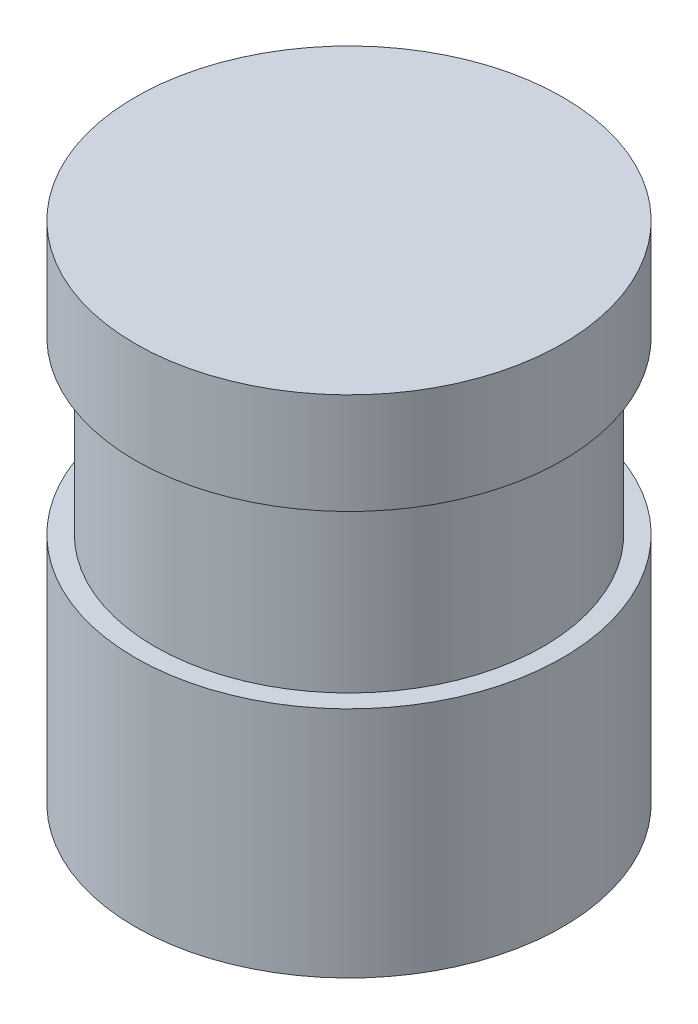
ISO-10303-21;
HEADER;
FILE_DESCRIPTION(('STEP AP214'),'2;1');
FILE_NAME('part.step','',(''),(''),'','','');
FILE_SCHEMA(('AUTOMOTIVE_DESIGN { 1 0 10303 214 1 1 1 1 }'));
ENDSEC;
DATA;
#1=APPLICATION_CONTEXT('core data for automotive mechanical design processes');
#2=APPLICATION_PROTOCOL_DEFINITION('international standard','automotive_design',2000,#1);
#3=PRODUCT_CONTEXT('',#1,'mechanical');
#4=PRODUCT('Part','Part','',(#3));
#5=PRODUCT_RELATED_PRODUCT_CATEGORY('part','',(#4));
#6=PRODUCT_DEFINITION_FORMATION('','',#4);
#7=PRODUCT_DEFINITION_CONTEXT('part definition',#1,'design');
#8=PRODUCT_DEFINITION('design','',#6,#7);
#9=PRODUCT_DEFINITION_SHAPE('','',#8);
#10=(LENGTH_UNIT() NAMED_UNIT(*) SI_UNIT(.MILLI.,.METRE.));
#11=(NAMED_UNIT(*) PLANE_ANGLE_UNIT() SI_UNIT($,.RADIAN.));
#12=(NAMED_UNIT(*) SI_UNIT($,.STERADIAN.) SOLID_ANGLE_UNIT());
#13=UNCERTAINTY_MEASURE_WITH_UNIT(LENGTH_MEASURE(1.E-05),#10,'distance_accuracy_value','');
#14=(GEOMETRIC_REPRESENTATION_CONTEXT(3) GLOBAL_UNCERTAINTY_ASSIGNED_CONTEXT((#13)) GLOBAL_UNIT_ASSIGNED_CONTEXT((#10,
#11,#12)) REPRESENTATION_CONTEXT('',''));
#15=CARTESIAN_POINT('',(0.,0.,0.));
#16=DIRECTION('',(0.,0.,1.));
#17=DIRECTION('',(1.,0.,0.));
#18=AXIS2_PLACEMENT_3D('',#15,#16,#17);
#19=CARTESIAN_POINT('',(0.,30.,0.));
#20=DIRECTION('',(0.,-1.,0.));
#21=DIRECTION('',(0.,0.,-1.));
#22=AXIS2_PLACEMENT_3D('',#19,#20,#21);
#23=CYLINDRICAL_SURFACE('',#22,27.5);
#24=CARTESIAN_POINT('',(0.,30.,0.));
#25=DIRECTION('',(0.,1.,0.));
#26=DIRECTION('',(0.,0.,1.));
#27=AXIS2_PLACEMENT_3D('',#24,#25,#26);
#28=CIRCLE('',#27,27.5);
#29=CARTESIAN_POINT('',(0.,30.,27.5));
#30=VERTEX_POINT('',#29);
#31=EDGE_CURVE('E45',#30,#30,#28,.T.);
#32=ORIENTED_EDGE('',*,*,#31,.F.);
#33=EDGE_LOOP('',(#32));
#34=FACE_BOUND('',#33,.T.);
#35=CARTESIAN_POINT('',(0.,0.,0.));
#36=DIRECTION('',(0.,1.,0.));
#37=DIRECTION('',(0.,0.,1.));
#38=AXIS2_PLACEMENT_3D('',#35,#36,#37);
#39=CIRCLE('',#38,27.5);
#40=CARTESIAN_POINT('',(0.,0.,27.5));
#41=VERTEX_POINT('',#40);
#42=EDGE_CURVE('E41',#41,#41,#39,.T.);
#43=ORIENTED_EDGE('',*,*,#42,.T.);
#44=EDGE_LOOP('',(#43));
#45=FACE_BOUND('',#44,.T.);
#46=ADVANCED_FACE('F38',(#34,#45),#23,.T.);
#47=CARTESIAN_POINT('',(0.,30.,0.));
#48=DIRECTION('',(0.,1.,0.));
#49=DIRECTION('',(0.,0.,1.));
#50=AXIS2_PLACEMENT_3D('',#47,#48,#49);
#51=PLANE('',#50);
#52=CARTESIAN_POINT('',(0.,30.,0.));
#53=DIRECTION('',(0.,1.,0.));
#54=DIRECTION('',(0.,0.,1.));
#55=AXIS2_PLACEMENT_3D('',#52,#53,#54);
#56=CIRCLE('',#55,25.);
#57=CARTESIAN_POINT('',(0.,30.,25.));
#58=VERTEX_POINT('',#57);
#59=EDGE_CURVE('E10',#58,#58,#56,.T.);
#60=ORIENTED_EDGE('',*,*,#59,.F.);
#61=EDGE_LOOP('',(#60));
#62=FACE_BOUND('',#61,.T.);
#63=ORIENTED_EDGE('',*,*,#31,.T.);
#64=EDGE_LOOP('',(#63));
#65=FACE_BOUND('',#64,.T.);
#66=ADVANCED_FACE('F79',(#62,#65),#51,.T.);
#67=CARTESIAN_POINT('',(0.,0.,0.));
#68=DIRECTION('',(0.,1.,0.));
#69=DIRECTION('',(0.,0.,1.));
#70=AXIS2_PLACEMENT_3D('',#67,#68,#69);
#71=PLANE('',#70);
#72=ORIENTED_EDGE('',*,*,#42,.F.);
#73=EDGE_LOOP('',(#72));
#74=FACE_BOUND('',#73,.T.);
#75=ADVANCED_FACE('F84',(#74),#71,.F.);
#76=CARTESIAN_POINT('',(0.,52.,0.));
#77=DIRECTION('',(0.,-1.,0.));
#78=DIRECTION('',(0.,0.,-1.));
#79=AXIS2_PLACEMENT_3D('',#76,#77,#78);
#80=CYLINDRICAL_SURFACE('',#79,25.);
#81=CARTESIAN_POINT('',(0.,52.,0.));
#82=DIRECTION('',(0.,1.,0.));
#83=DIRECTION('',(0.,0.,1.));
#84=AXIS2_PLACEMENT_3D('',#81,#82,#83);
#85=CIRCLE('',#84,25.);
#86=CARTESIAN_POINT('',(0.,52.,25.));
#87=VERTEX_POINT('',#86);
#88=EDGE_CURVE('E51',#87,#87,#85,.T.);
#89=ORIENTED_EDGE('',*,*,#88,.F.);
#90=EDGE_LOOP('',(#89));
#91=FACE_BOUND('',#90,.T.);
#92=ORIENTED_EDGE('',*,*,#59,.T.);
#93=EDGE_LOOP('',(#92));
#94=FACE_BOUND('',#93,.T.);
#95=ADVANCED_FACE('F66',(#91,#94),#80,.T.);
#96=CARTESIAN_POINT('',(0.,65.,0.));
#97=DIRECTION('',(0.,-1.,0.));
#98=DIRECTION('',(0.,0.,-1.));
#99=AXIS2_PLACEMENT_3D('',#96,#97,#98);
#100=CYLINDRICAL_SURFACE('',#99,27.5);
#101=CARTESIAN_POINT('',(0.,65.,0.));
#102=DIRECTION('',(0.,1.,0.));
#103=DIRECTION('',(0.,0.,1.));
#104=AXIS2_PLACEMENT_3D('',#101,#102,#103);
#105=CIRCLE('',#104,27.5);
#106=CARTESIAN_POINT('',(0.,65.,27.5));
#107=VERTEX_POINT('',#106);
#108=EDGE_CURVE('E54',#107,#107,#105,.T.);
#109=ORIENTED_EDGE('',*,*,#108,.F.);
#110=EDGE_LOOP('',(#109));
#111=FACE_BOUND('',#110,.T.);
#112=CARTESIAN_POINT('',(0.,52.,0.));
#113=DIRECTION('',(0.,1.,0.));
#114=DIRECTION('',(0.,0.,1.));
#115=AXIS2_PLACEMENT_3D('',#112,#113,#114);
#116=CIRCLE('',#115,27.5);
#117=CARTESIAN_POINT('',(0.,52.,27.5));
#118=VERTEX_POINT('',#117);
#119=EDGE_CURVE('E55',#118,#118,#116,.T.);
#120=ORIENTED_EDGE('',*,*,#119,.T.);
#121=EDGE_LOOP('',(#120));
#122=FACE_BOUND('',#121,.T.);
#123=ADVANCED_FACE('F63',(#111,#122),#100,.T.);
#124=CARTESIAN_POINT('',(0.,65.,0.));
#125=DIRECTION('',(0.,1.,0.));
#126=DIRECTION('',(0.,0.,1.));
#127=AXIS2_PLACEMENT_3D('',#124,#125,#126);
#128=PLANE('',#127);
#129=ORIENTED_EDGE('',*,*,#108,.T.);
#130=EDGE_LOOP('',(#129));
#131=FACE_BOUND('',#130,.T.);
#132=ADVANCED_FACE('F61',(#131),#128,.T.);
#133=CARTESIAN_POINT('',(0.,52.,0.));
#134=DIRECTION('',(0.,1.,0.));
#135=DIRECTION('',(0.,0.,1.));
#136=AXIS2_PLACEMENT_3D('',#133,#134,#135);
#137=PLANE('',#136);
#138=ORIENTED_EDGE('',*,*,#88,.T.);
#139=EDGE_LOOP('',(#138));
#140=FACE_BOUND('',#139,.T.);
#141=ORIENTED_EDGE('',*,*,#119,.F.);
#142=EDGE_LOOP('',(#141));
#143=FACE_BOUND('',#142,.T.);
#144=ADVANCED_FACE('F70',(#140,#143),#137,.F.);
#145=CLOSED_SHELL('',(#46,#66,#75,#95,#123,#132,#144));
#146=MANIFOLD_SOLID_BREP('B2',#145);
#147=ADVANCED_BREP_SHAPE_REPRESENTATION('',(#18,#146),#14);
#148=SHAPE_DEFINITION_REPRESENTATION(#9,#147);
ENDSEC;
END-ISO-10303-21;
